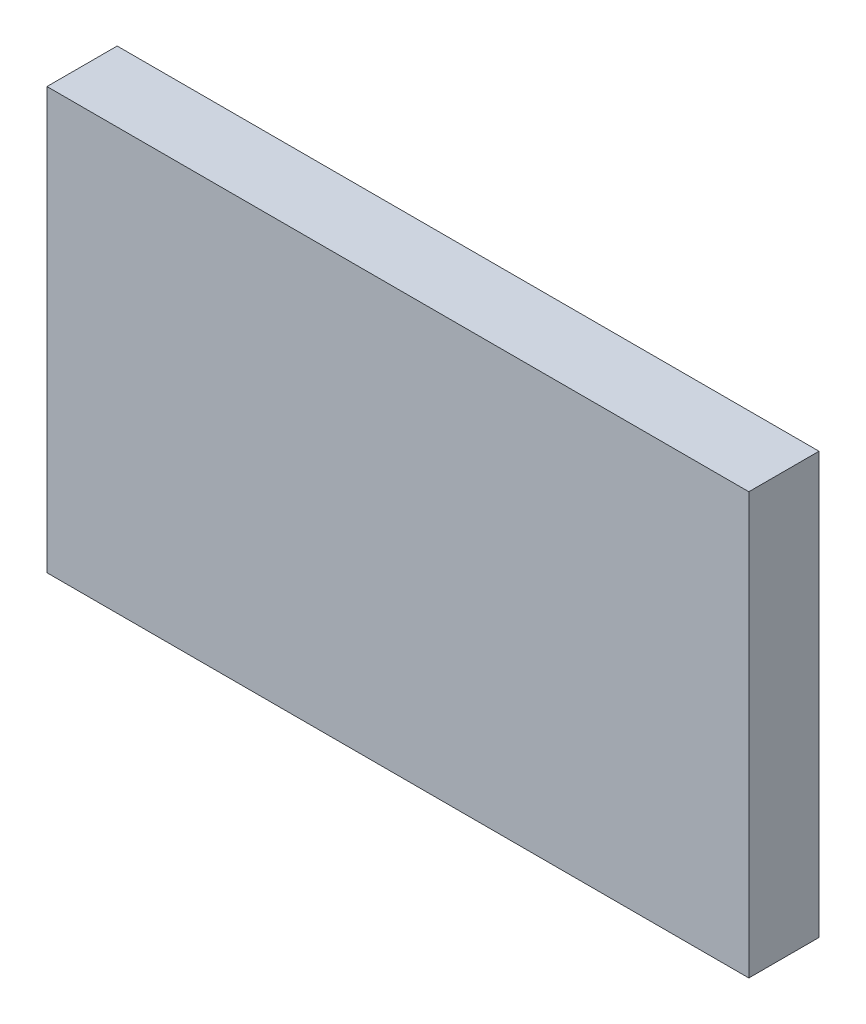
ISO-10303-21;
HEADER;
FILE_DESCRIPTION(('STEP AP214'),'2;1');
FILE_NAME('part.step','',(''),(''),'','','');
FILE_SCHEMA(('AUTOMOTIVE_DESIGN { 1 0 10303 214 1 1 1 1 }'));
ENDSEC;
DATA;
#1=APPLICATION_CONTEXT('core data for automotive mechanical design processes');
#2=APPLICATION_PROTOCOL_DEFINITION('international standard','automotive_design',2000,#1);
#3=PRODUCT_CONTEXT('',#1,'mechanical');
#4=PRODUCT('Part','Part','',(#3));
#5=PRODUCT_RELATED_PRODUCT_CATEGORY('part','',(#4));
#6=PRODUCT_DEFINITION_FORMATION('','',#4);
#7=PRODUCT_DEFINITION_CONTEXT('part definition',#1,'design');
#8=PRODUCT_DEFINITION('design','',#6,#7);
#9=PRODUCT_DEFINITION_SHAPE('','',#8);
#10=(LENGTH_UNIT() NAMED_UNIT(*) SI_UNIT(.MILLI.,.METRE.));
#11=(NAMED_UNIT(*) PLANE_ANGLE_UNIT() SI_UNIT($,.RADIAN.));
#12=(NAMED_UNIT(*) SI_UNIT($,.STERADIAN.) SOLID_ANGLE_UNIT());
#13=UNCERTAINTY_MEASURE_WITH_UNIT(LENGTH_MEASURE(1.E-05),#10,'distance_accuracy_value','');
#14=(GEOMETRIC_REPRESENTATION_CONTEXT(3) GLOBAL_UNCERTAINTY_ASSIGNED_CONTEXT((#13)) GLOBAL_UNIT_ASSIGNED_CONTEXT((#10,
#11,#12)) REPRESENTATION_CONTEXT('',''));
#15=CARTESIAN_POINT('',(0.,0.,0.));
#16=DIRECTION('',(0.,0.,1.));
#17=DIRECTION('',(1.,0.,0.));
#18=AXIS2_PLACEMENT_3D('',#15,#16,#17);
#19=CARTESIAN_POINT('',(250.,-150.,50.));
#20=DIRECTION('',(-1.,0.,0.));
#21=DIRECTION('',(0.,0.,1.));
#22=AXIS2_PLACEMENT_3D('',#19,#20,#21);
#23=PLANE('',#22);
#24=DIRECTION('',(0.,1.,0.));
#25=VECTOR('',#24,1.);
#26=CARTESIAN_POINT('',(250.,-150.,0.));
#27=LINE('',#26,#25);
#28=CARTESIAN_POINT('',(250.,-150.,0.));
#29=VERTEX_POINT('',#28);
#30=CARTESIAN_POINT('',(250.,150.,0.));
#31=VERTEX_POINT('',#30);
#32=EDGE_CURVE('E104',#29,#31,#27,.T.);
#33=ORIENTED_EDGE('',*,*,#32,.T.);
#34=DIRECTION('',(0.,0.,-1.));
#35=VECTOR('',#34,1.);
#36=CARTESIAN_POINT('',(250.,150.,50.));
#37=LINE('',#36,#35);
#38=CARTESIAN_POINT('',(250.,150.,50.));
#39=VERTEX_POINT('',#38);
#40=EDGE_CURVE('E11',#39,#31,#37,.T.);
#41=ORIENTED_EDGE('',*,*,#40,.F.);
#42=DIRECTION('',(0.,1.,0.));
#43=VECTOR('',#42,1.);
#44=CARTESIAN_POINT('',(250.,-150.,50.));
#45=LINE('',#44,#43);
#46=CARTESIAN_POINT('',(250.,-150.,50.));
#47=VERTEX_POINT('',#46);
#48=EDGE_CURVE('E92',#47,#39,#45,.T.);
#49=ORIENTED_EDGE('',*,*,#48,.F.);
#50=DIRECTION('',(0.,0.,-1.));
#51=VECTOR('',#50,1.);
#52=CARTESIAN_POINT('',(250.,-150.,50.));
#53=LINE('',#52,#51);
#54=EDGE_CURVE('E100',#47,#29,#53,.T.);
#55=ORIENTED_EDGE('',*,*,#54,.T.);
#56=EDGE_LOOP('',(#33,#41,#49,#55));
#57=FACE_BOUND('',#56,.T.);
#58=ADVANCED_FACE('F41',(#57),#23,.F.);
#59=CARTESIAN_POINT('',(-250.,150.,50.));
#60=DIRECTION('',(0.,-1.,0.));
#61=DIRECTION('',(0.,0.,-1.));
#62=AXIS2_PLACEMENT_3D('',#59,#60,#61);
#63=PLANE('',#62);
#64=DIRECTION('',(-1.,0.,0.));
#65=VECTOR('',#64,1.);
#66=CARTESIAN_POINT('',(-250.,150.,0.));
#67=LINE('',#66,#65);
#68=CARTESIAN_POINT('',(-250.,150.,0.));
#69=VERTEX_POINT('',#68);
#70=EDGE_CURVE('E96',#31,#69,#67,.T.);
#71=ORIENTED_EDGE('',*,*,#70,.T.);
#72=DIRECTION('',(0.,0.,-1.));
#73=VECTOR('',#72,1.);
#74=CARTESIAN_POINT('',(-250.,150.,50.));
#75=LINE('',#74,#73);
#76=CARTESIAN_POINT('',(-250.,150.,50.));
#77=VERTEX_POINT('',#76);
#78=EDGE_CURVE('E49',#77,#69,#75,.T.);
#79=ORIENTED_EDGE('',*,*,#78,.F.);
#80=DIRECTION('',(-1.,0.,0.));
#81=VECTOR('',#80,1.);
#82=CARTESIAN_POINT('',(-250.,150.,50.));
#83=LINE('',#82,#81);
#84=EDGE_CURVE('E87',#39,#77,#83,.T.);
#85=ORIENTED_EDGE('',*,*,#84,.F.);
#86=ORIENTED_EDGE('',*,*,#40,.T.);
#87=EDGE_LOOP('',(#71,#79,#85,#86));
#88=FACE_BOUND('',#87,.T.);
#89=ADVANCED_FACE('F95',(#88),#63,.F.);
#90=CARTESIAN_POINT('',(-250.,-150.,50.));
#91=DIRECTION('',(1.,0.,0.));
#92=DIRECTION('',(0.,0.,-1.));
#93=AXIS2_PLACEMENT_3D('',#90,#91,#92);
#94=PLANE('',#93);
#95=DIRECTION('',(0.,-1.,0.));
#96=VECTOR('',#95,1.);
#97=CARTESIAN_POINT('',(-250.,-150.,0.));
#98=LINE('',#97,#96);
#99=CARTESIAN_POINT('',(-250.,-150.,0.));
#100=VERTEX_POINT('',#99);
#101=EDGE_CURVE('E74',#69,#100,#98,.T.);
#102=ORIENTED_EDGE('',*,*,#101,.T.);
#103=DIRECTION('',(0.,0.,-1.));
#104=VECTOR('',#103,1.);
#105=CARTESIAN_POINT('',(-250.,-150.,50.));
#106=LINE('',#105,#104);
#107=CARTESIAN_POINT('',(-250.,-150.,50.));
#108=VERTEX_POINT('',#107);
#109=EDGE_CURVE('E97',#108,#100,#106,.T.);
#110=ORIENTED_EDGE('',*,*,#109,.F.);
#111=DIRECTION('',(0.,-1.,0.));
#112=VECTOR('',#111,1.);
#113=CARTESIAN_POINT('',(-250.,-150.,50.));
#114=LINE('',#113,#112);
#115=EDGE_CURVE('E90',#77,#108,#114,.T.);
#116=ORIENTED_EDGE('',*,*,#115,.F.);
#117=ORIENTED_EDGE('',*,*,#78,.T.);
#118=EDGE_LOOP('',(#102,#110,#116,#117));
#119=FACE_BOUND('',#118,.T.);
#120=ADVANCED_FACE('F98',(#119),#94,.F.);
#121=CARTESIAN_POINT('',(-250.,-150.,50.));
#122=DIRECTION('',(0.,1.,0.));
#123=DIRECTION('',(0.,0.,1.));
#124=AXIS2_PLACEMENT_3D('',#121,#122,#123);
#125=PLANE('',#124);
#126=DIRECTION('',(1.,0.,0.));
#127=VECTOR('',#126,1.);
#128=CARTESIAN_POINT('',(-250.,-150.,0.));
#129=LINE('',#128,#127);
#130=EDGE_CURVE('E80',#100,#29,#129,.T.);
#131=ORIENTED_EDGE('',*,*,#130,.T.);
#132=ORIENTED_EDGE('',*,*,#54,.F.);
#133=DIRECTION('',(1.,0.,0.));
#134=VECTOR('',#133,1.);
#135=CARTESIAN_POINT('',(-250.,-150.,50.));
#136=LINE('',#135,#134);
#137=EDGE_CURVE('E57',#108,#47,#136,.T.);
#138=ORIENTED_EDGE('',*,*,#137,.F.);
#139=ORIENTED_EDGE('',*,*,#109,.T.);
#140=EDGE_LOOP('',(#131,#132,#138,#139));
#141=FACE_BOUND('',#140,.T.);
#142=ADVANCED_FACE('F111',(#141),#125,.F.);
#143=CARTESIAN_POINT('',(0.,0.,50.));
#144=DIRECTION('',(0.,0.,-1.));
#145=DIRECTION('',(-1.,0.,0.));
#146=AXIS2_PLACEMENT_3D('',#143,#144,#145);
#147=PLANE('',#146);
#148=ORIENTED_EDGE('',*,*,#48,.T.);
#149=ORIENTED_EDGE('',*,*,#84,.T.);
#150=ORIENTED_EDGE('',*,*,#115,.T.);
#151=ORIENTED_EDGE('',*,*,#137,.T.);
#152=EDGE_LOOP('',(#148,#149,#150,#151));
#153=FACE_BOUND('',#152,.T.);
#154=ADVANCED_FACE('F88',(#153),#147,.F.);
#155=CARTESIAN_POINT('',(0.,0.,0.));
#156=DIRECTION('',(0.,0.,-1.));
#157=DIRECTION('',(-1.,0.,0.));
#158=AXIS2_PLACEMENT_3D('',#155,#156,#157);
#159=PLANE('',#158);
#160=ORIENTED_EDGE('',*,*,#32,.F.);
#161=ORIENTED_EDGE('',*,*,#130,.F.);
#162=ORIENTED_EDGE('',*,*,#101,.F.);
#163=ORIENTED_EDGE('',*,*,#70,.F.);
#164=EDGE_LOOP('',(#160,#161,#162,#163));
#165=FACE_BOUND('',#164,.T.);
#166=ADVANCED_FACE('F114',(#165),#159,.T.);
#167=CLOSED_SHELL('',(#58,#89,#120,#142,#154,#166));
#168=MANIFOLD_SOLID_BREP('B2',#167);
#169=ADVANCED_BREP_SHAPE_REPRESENTATION('',(#18,#168),#14);
#170=SHAPE_DEFINITION_REPRESENTATION(#9,#169);
ENDSEC;
END-ISO-10303-21;
